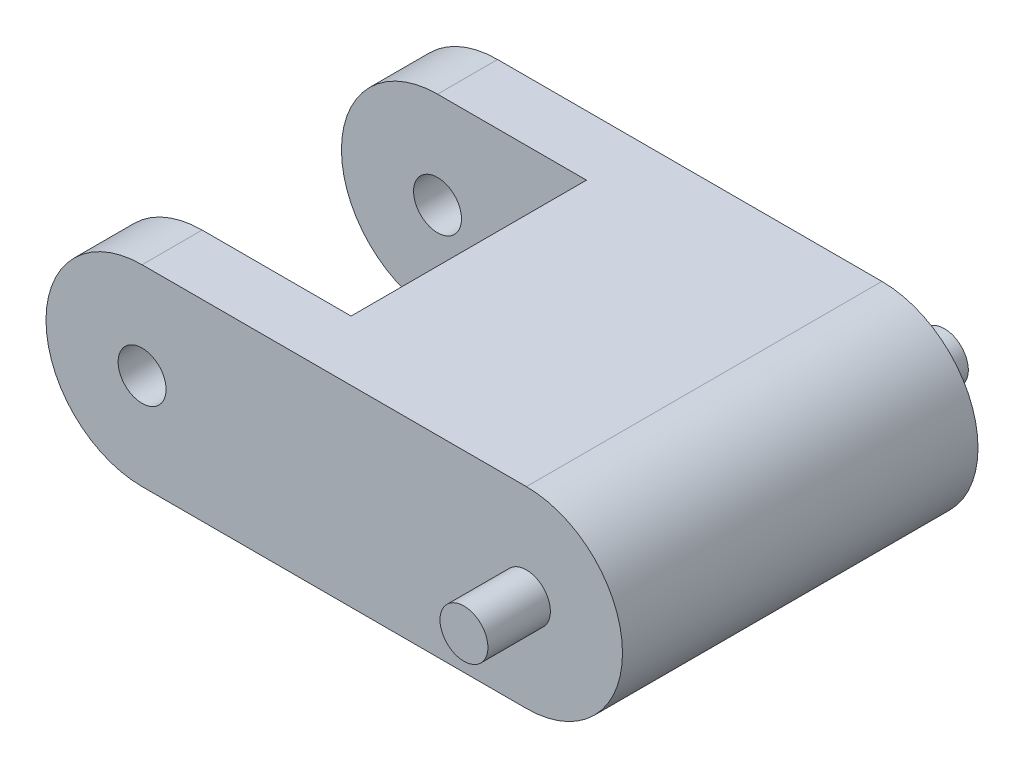
ISO-10303-21;
HEADER;
FILE_DESCRIPTION(('STEP AP214'),'2;1');
FILE_NAME('part.step','',(''),(''),'','','');
FILE_SCHEMA(('AUTOMOTIVE_DESIGN { 1 0 10303 214 1 1 1 1 }'));
ENDSEC;
DATA;
#1=APPLICATION_CONTEXT('core data for automotive mechanical design processes');
#2=APPLICATION_PROTOCOL_DEFINITION('international standard','automotive_design',2000,#1);
#3=PRODUCT_CONTEXT('',#1,'mechanical');
#4=PRODUCT('Part','Part','',(#3));
#5=PRODUCT_RELATED_PRODUCT_CATEGORY('part','',(#4));
#6=PRODUCT_DEFINITION_FORMATION('','',#4);
#7=PRODUCT_DEFINITION_CONTEXT('part definition',#1,'design');
#8=PRODUCT_DEFINITION('design','',#6,#7);
#9=PRODUCT_DEFINITION_SHAPE('','',#8);
#10=(LENGTH_UNIT() NAMED_UNIT(*) SI_UNIT(.MILLI.,.METRE.));
#11=(NAMED_UNIT(*) PLANE_ANGLE_UNIT() SI_UNIT($,.RADIAN.));
#12=(NAMED_UNIT(*) SI_UNIT($,.STERADIAN.) SOLID_ANGLE_UNIT());
#13=UNCERTAINTY_MEASURE_WITH_UNIT(LENGTH_MEASURE(1.E-05),#10,'distance_accuracy_value','');
#14=(GEOMETRIC_REPRESENTATION_CONTEXT(3) GLOBAL_UNCERTAINTY_ASSIGNED_CONTEXT((#13)) GLOBAL_UNIT_ASSIGNED_CONTEXT((#10,
#11,#12)) REPRESENTATION_CONTEXT('',''));
#15=CARTESIAN_POINT('',(0.,0.,0.));
#16=DIRECTION('',(0.,0.,1.));
#17=DIRECTION('',(1.,0.,0.));
#18=AXIS2_PLACEMENT_3D('',#15,#16,#17);
#19=CARTESIAN_POINT('',(0.,0.,148.));
#20=DIRECTION('',(0.,0.,-1.));
#21=DIRECTION('',(-1.,0.,0.));
#22=AXIS2_PLACEMENT_3D('',#19,#20,#21);
#23=CYLINDRICAL_SURFACE('',#22,40.);
#24=DIRECTION('',(0.,0.,-1.));
#25=VECTOR('',#24,1.);
#26=CARTESIAN_POINT('',(0.,40.,148.));
#27=LINE('',#26,#25);
#28=CARTESIAN_POINT('',(0.,40.,148.));
#29=VERTEX_POINT('',#28);
#30=CARTESIAN_POINT('',(0.,40.,123.));
#31=VERTEX_POINT('',#30);
#32=EDGE_CURVE('E170',#29,#31,#27,.T.);
#33=ORIENTED_EDGE('',*,*,#32,.T.);
#34=CARTESIAN_POINT('',(0.,0.,123.));
#35=DIRECTION('',(0.,0.,1.));
#36=DIRECTION('',(1.,0.,0.));
#37=AXIS2_PLACEMENT_3D('',#34,#35,#36);
#38=CIRCLE('',#37,40.);
#39=CARTESIAN_POINT('',(0.,-40.,123.));
#40=VERTEX_POINT('',#39);
#41=EDGE_CURVE('E123',#31,#40,#38,.T.);
#42=ORIENTED_EDGE('',*,*,#41,.T.);
#43=DIRECTION('',(0.,0.,-1.));
#44=VECTOR('',#43,1.);
#45=CARTESIAN_POINT('',(0.,-40.,148.));
#46=LINE('',#45,#44);
#47=CARTESIAN_POINT('',(0.,-40.,148.));
#48=VERTEX_POINT('',#47);
#49=EDGE_CURVE('E41',#48,#40,#46,.T.);
#50=ORIENTED_EDGE('',*,*,#49,.F.);
#51=CARTESIAN_POINT('',(0.,0.,148.));
#52=DIRECTION('',(0.,0.,1.));
#53=DIRECTION('',(1.,0.,0.));
#54=AXIS2_PLACEMENT_3D('',#51,#52,#53);
#55=CIRCLE('',#54,40.);
#56=EDGE_CURVE('E157',#29,#48,#55,.T.);
#57=ORIENTED_EDGE('',*,*,#56,.F.);
#58=EDGE_LOOP('',(#33,#42,#50,#57));
#59=FACE_BOUND('',#58,.T.);
#60=ADVANCED_FACE('F32',(#59),#23,.T.);
#61=CARTESIAN_POINT('',(0.,0.,148.));
#62=DIRECTION('',(0.,0.,-1.));
#63=DIRECTION('',(-1.,0.,0.));
#64=AXIS2_PLACEMENT_3D('',#61,#62,#63);
#65=CYLINDRICAL_SURFACE('',#64,9.977);
#66=CARTESIAN_POINT('',(0.,0.,123.));
#67=DIRECTION('',(0.,0.,1.));
#68=DIRECTION('',(1.,0.,0.));
#69=AXIS2_PLACEMENT_3D('',#66,#67,#68);
#70=CIRCLE('',#69,9.977);
#71=CARTESIAN_POINT('',(9.977,0.,123.));
#72=VERTEX_POINT('',#71);
#73=EDGE_CURVE('E36',#72,#72,#70,.T.);
#74=ORIENTED_EDGE('',*,*,#73,.F.);
#75=EDGE_LOOP('',(#74));
#76=FACE_BOUND('',#75,.T.);
#77=CARTESIAN_POINT('',(0.,0.,148.));
#78=DIRECTION('',(0.,0.,1.));
#79=DIRECTION('',(1.,0.,0.));
#80=AXIS2_PLACEMENT_3D('',#77,#78,#79);
#81=CIRCLE('',#80,9.977);
#82=CARTESIAN_POINT('',(9.977,0.,148.));
#83=VERTEX_POINT('',#82);
#84=EDGE_CURVE('E150',#83,#83,#81,.T.);
#85=ORIENTED_EDGE('',*,*,#84,.T.);
#86=EDGE_LOOP('',(#85));
#87=FACE_BOUND('',#86,.T.);
#88=ADVANCED_FACE('F192',(#76,#87),#65,.F.);
#89=CARTESIAN_POINT('',(0.,0.,148.));
#90=DIRECTION('',(0.,0.,1.));
#91=DIRECTION('',(1.,0.,0.));
#92=AXIS2_PLACEMENT_3D('',#89,#90,#91);
#93=PLANE('',#92);
#94=CARTESIAN_POINT('',(160.,0.,148.));
#95=DIRECTION('',(0.,0.,1.));
#96=DIRECTION('',(1.,0.,0.));
#97=AXIS2_PLACEMENT_3D('',#94,#95,#96);
#98=CIRCLE('',#97,9.97699999999998);
#99=CARTESIAN_POINT('',(169.977,0.,148.));
#100=VERTEX_POINT('',#99);
#101=EDGE_CURVE('E11',#100,#100,#98,.T.);
#102=ORIENTED_EDGE('',*,*,#101,.F.);
#103=EDGE_LOOP('',(#102));
#104=FACE_BOUND('',#103,.T.);
#105=ORIENTED_EDGE('',*,*,#56,.T.);
#106=DIRECTION('',(1.,0.,0.));
#107=VECTOR('',#106,1.);
#108=CARTESIAN_POINT('',(0.,-40.,148.));
#109=LINE('',#108,#107);
#110=CARTESIAN_POINT('',(160.,-40.,148.));
#111=VERTEX_POINT('',#110);
#112=EDGE_CURVE('E88',#48,#111,#109,.T.);
#113=ORIENTED_EDGE('',*,*,#112,.T.);
#114=CARTESIAN_POINT('',(160.,0.,148.));
#115=DIRECTION('',(0.,0.,1.));
#116=DIRECTION('',(1.,0.,0.));
#117=AXIS2_PLACEMENT_3D('',#114,#115,#116);
#118=CIRCLE('',#117,40.);
#119=CARTESIAN_POINT('',(160.,40.,148.));
#120=VERTEX_POINT('',#119);
#121=EDGE_CURVE('E161',#111,#120,#118,.T.);
#122=ORIENTED_EDGE('',*,*,#121,.T.);
#123=DIRECTION('',(-1.,0.,0.));
#124=VECTOR('',#123,1.);
#125=CARTESIAN_POINT('',(0.,40.,148.));
#126=LINE('',#125,#124);
#127=EDGE_CURVE('E58',#120,#29,#126,.T.);
#128=ORIENTED_EDGE('',*,*,#127,.T.);
#129=EDGE_LOOP('',(#105,#113,#122,#128));
#130=FACE_BOUND('',#129,.T.);
#131=ORIENTED_EDGE('',*,*,#84,.F.);
#132=EDGE_LOOP('',(#131));
#133=FACE_BOUND('',#132,.T.);
#134=ADVANCED_FACE('F197',(#104,#130,#133),#93,.T.);
#135=CARTESIAN_POINT('',(0.,0.,0.));
#136=DIRECTION('',(0.,0.,1.));
#137=DIRECTION('',(1.,0.,0.));
#138=AXIS2_PLACEMENT_3D('',#135,#136,#137);
#139=PLANE('',#138);
#140=CARTESIAN_POINT('',(160.,0.,0.));
#141=DIRECTION('',(0.,0.,1.));
#142=DIRECTION('',(1.,0.,0.));
#143=AXIS2_PLACEMENT_3D('',#140,#141,#142);
#144=CIRCLE('',#143,9.97699999999998);
#145=CARTESIAN_POINT('',(169.977,0.,0.));
#146=VERTEX_POINT('',#145);
#147=EDGE_CURVE('E148',#146,#146,#144,.T.);
#148=ORIENTED_EDGE('',*,*,#147,.T.);
#149=EDGE_LOOP('',(#148));
#150=FACE_BOUND('',#149,.T.);
#151=CARTESIAN_POINT('',(0.,0.,0.));
#152=DIRECTION('',(0.,0.,1.));
#153=DIRECTION('',(1.,0.,0.));
#154=AXIS2_PLACEMENT_3D('',#151,#152,#153);
#155=CIRCLE('',#154,40.);
#156=CARTESIAN_POINT('',(0.,40.,0.));
#157=VERTEX_POINT('',#156);
#158=CARTESIAN_POINT('',(0.,-40.,0.));
#159=VERTEX_POINT('',#158);
#160=EDGE_CURVE('E153',#157,#159,#155,.T.);
#161=ORIENTED_EDGE('',*,*,#160,.F.);
#162=DIRECTION('',(-1.,0.,0.));
#163=VECTOR('',#162,1.);
#164=CARTESIAN_POINT('',(0.,40.,0.));
#165=LINE('',#164,#163);
#166=CARTESIAN_POINT('',(160.,40.,0.));
#167=VERTEX_POINT('',#166);
#168=EDGE_CURVE('E159',#167,#157,#165,.T.);
#169=ORIENTED_EDGE('',*,*,#168,.F.);
#170=CARTESIAN_POINT('',(160.,0.,0.));
#171=DIRECTION('',(0.,0.,1.));
#172=DIRECTION('',(1.,0.,0.));
#173=AXIS2_PLACEMENT_3D('',#170,#171,#172);
#174=CIRCLE('',#173,40.);
#175=CARTESIAN_POINT('',(160.,-40.,0.));
#176=VERTEX_POINT('',#175);
#177=EDGE_CURVE('E167',#176,#167,#174,.T.);
#178=ORIENTED_EDGE('',*,*,#177,.F.);
#179=DIRECTION('',(1.,0.,0.));
#180=VECTOR('',#179,1.);
#181=CARTESIAN_POINT('',(0.,-40.,0.));
#182=LINE('',#181,#180);
#183=EDGE_CURVE('E165',#159,#176,#182,.T.);
#184=ORIENTED_EDGE('',*,*,#183,.F.);
#185=EDGE_LOOP('',(#161,#169,#178,#184));
#186=FACE_BOUND('',#185,.T.);
#187=CARTESIAN_POINT('',(0.,0.,0.));
#188=DIRECTION('',(0.,0.,1.));
#189=DIRECTION('',(1.,0.,0.));
#190=AXIS2_PLACEMENT_3D('',#187,#188,#189);
#191=CIRCLE('',#190,9.977);
#192=CARTESIAN_POINT('',(9.977,0.,0.));
#193=VERTEX_POINT('',#192);
#194=EDGE_CURVE('E154',#193,#193,#191,.T.);
#195=ORIENTED_EDGE('',*,*,#194,.T.);
#196=EDGE_LOOP('',(#195));
#197=FACE_BOUND('',#196,.T.);
#198=ADVANCED_FACE('F195',(#150,#186,#197),#139,.F.);
#199=CARTESIAN_POINT('',(0.,-40.,25.));
#200=VERTEX_POINT('',#199);
#201=EDGE_CURVE('E178',#200,#159,#46,.T.);
#202=ORIENTED_EDGE('',*,*,#201,.F.);
#203=CARTESIAN_POINT('',(0.,0.,25.));
#204=DIRECTION('',(0.,0.,-1.));
#205=DIRECTION('',(-1.,0.,0.));
#206=AXIS2_PLACEMENT_3D('',#203,#204,#205);
#207=CIRCLE('',#206,40.);
#208=CARTESIAN_POINT('',(0.,40.,25.));
#209=VERTEX_POINT('',#208);
#210=EDGE_CURVE('E137',#200,#209,#207,.T.);
#211=ORIENTED_EDGE('',*,*,#210,.T.);
#212=EDGE_CURVE('E80',#209,#157,#27,.T.);
#213=ORIENTED_EDGE('',*,*,#212,.T.);
#214=ORIENTED_EDGE('',*,*,#160,.T.);
#215=EDGE_LOOP('',(#202,#211,#213,#214));
#216=FACE_BOUND('',#215,.T.);
#217=ADVANCED_FACE('F34',(#216),#23,.T.);
#218=CARTESIAN_POINT('',(0.,-40.,148.));
#219=DIRECTION('',(0.,1.,0.));
#220=DIRECTION('',(-1.,0.,0.));
#221=AXIS2_PLACEMENT_3D('',#218,#219,#220);
#222=PLANE('',#221);
#223=ORIENTED_EDGE('',*,*,#49,.T.);
#224=DIRECTION('',(1.,0.,0.));
#225=VECTOR('',#224,1.);
#226=CARTESIAN_POINT('',(0.,-40.,123.));
#227=LINE('',#226,#225);
#228=CARTESIAN_POINT('',(62.0052820620174,-40.,123.));
#229=VERTEX_POINT('',#228);
#230=EDGE_CURVE('E139',#40,#229,#227,.T.);
#231=ORIENTED_EDGE('',*,*,#230,.T.);
#232=DIRECTION('',(0.,0.,-1.));
#233=VECTOR('',#232,1.);
#234=CARTESIAN_POINT('',(62.0052820620174,-40.,148.));
#235=LINE('',#234,#233);
#236=CARTESIAN_POINT('',(62.0052820620174,-40.,25.));
#237=VERTEX_POINT('',#236);
#238=EDGE_CURVE('E113',#229,#237,#235,.T.);
#239=ORIENTED_EDGE('',*,*,#238,.T.);
#240=DIRECTION('',(-1.,0.,0.));
#241=VECTOR('',#240,1.);
#242=CARTESIAN_POINT('',(0.,-40.,25.));
#243=LINE('',#242,#241);
#244=EDGE_CURVE('E134',#237,#200,#243,.T.);
#245=ORIENTED_EDGE('',*,*,#244,.T.);
#246=ORIENTED_EDGE('',*,*,#201,.T.);
#247=ORIENTED_EDGE('',*,*,#183,.T.);
#248=DIRECTION('',(0.,0.,-1.));
#249=VECTOR('',#248,1.);
#250=CARTESIAN_POINT('',(160.,-40.,148.));
#251=LINE('',#250,#249);
#252=EDGE_CURVE('E175',#111,#176,#251,.T.);
#253=ORIENTED_EDGE('',*,*,#252,.F.);
#254=ORIENTED_EDGE('',*,*,#112,.F.);
#255=EDGE_LOOP('',(#223,#231,#239,#245,#246,#247,#253,#254));
#256=FACE_BOUND('',#255,.T.);
#257=ADVANCED_FACE('F204',(#256),#222,.F.);
#258=CARTESIAN_POINT('',(160.,0.,148.));
#259=DIRECTION('',(0.,0.,-1.));
#260=DIRECTION('',(-1.,0.,0.));
#261=AXIS2_PLACEMENT_3D('',#258,#259,#260);
#262=CYLINDRICAL_SURFACE('',#261,40.);
#263=ORIENTED_EDGE('',*,*,#177,.T.);
#264=DIRECTION('',(0.,0.,-1.));
#265=VECTOR('',#264,1.);
#266=CARTESIAN_POINT('',(160.,40.,148.));
#267=LINE('',#266,#265);
#268=EDGE_CURVE('E172',#120,#167,#267,.T.);
#269=ORIENTED_EDGE('',*,*,#268,.F.);
#270=ORIENTED_EDGE('',*,*,#121,.F.);
#271=ORIENTED_EDGE('',*,*,#252,.T.);
#272=EDGE_LOOP('',(#263,#269,#270,#271));
#273=FACE_BOUND('',#272,.T.);
#274=ADVANCED_FACE('F256',(#273),#262,.T.);
#275=CARTESIAN_POINT('',(0.,40.,148.));
#276=DIRECTION('',(0.,-1.,0.));
#277=DIRECTION('',(0.,0.,-1.));
#278=AXIS2_PLACEMENT_3D('',#275,#276,#277);
#279=PLANE('',#278);
#280=DIRECTION('',(0.,0.,-1.));
#281=VECTOR('',#280,1.);
#282=CARTESIAN_POINT('',(62.0052820620174,40.,25.));
#283=LINE('',#282,#281);
#284=CARTESIAN_POINT('',(62.0052820620174,40.,123.));
#285=VERTEX_POINT('',#284);
#286=CARTESIAN_POINT('',(62.0052820620174,40.,25.));
#287=VERTEX_POINT('',#286);
#288=EDGE_CURVE('E49',#285,#287,#283,.T.);
#289=ORIENTED_EDGE('',*,*,#288,.F.);
#290=DIRECTION('',(1.,0.,0.));
#291=VECTOR('',#290,1.);
#292=CARTESIAN_POINT('',(62.0052820620174,40.,123.));
#293=LINE('',#292,#291);
#294=EDGE_CURVE('E120',#31,#285,#293,.T.);
#295=ORIENTED_EDGE('',*,*,#294,.F.);
#296=ORIENTED_EDGE('',*,*,#32,.F.);
#297=ORIENTED_EDGE('',*,*,#127,.F.);
#298=ORIENTED_EDGE('',*,*,#268,.T.);
#299=ORIENTED_EDGE('',*,*,#168,.T.);
#300=ORIENTED_EDGE('',*,*,#212,.F.);
#301=DIRECTION('',(-1.,0.,0.));
#302=VECTOR('',#301,1.);
#303=CARTESIAN_POINT('',(62.0052820620174,40.,25.));
#304=LINE('',#303,#302);
#305=EDGE_CURVE('E126',#287,#209,#304,.T.);
#306=ORIENTED_EDGE('',*,*,#305,.F.);
#307=EDGE_LOOP('',(#289,#295,#296,#297,#298,#299,#300,#306));
#308=FACE_BOUND('',#307,.T.);
#309=ADVANCED_FACE('F129',(#308),#279,.F.);
#310=CARTESIAN_POINT('',(0.,0.,25.));
#311=DIRECTION('',(0.,0.,-1.));
#312=DIRECTION('',(-1.,0.,0.));
#313=AXIS2_PLACEMENT_3D('',#310,#311,#312);
#314=CIRCLE('',#313,9.977);
#315=CARTESIAN_POINT('',(-9.977,0.,25.));
#316=VERTEX_POINT('',#315);
#317=EDGE_CURVE('E116',#316,#316,#314,.T.);
#318=ORIENTED_EDGE('',*,*,#317,.F.);
#319=EDGE_LOOP('',(#318));
#320=FACE_BOUND('',#319,.T.);
#321=ORIENTED_EDGE('',*,*,#194,.F.);
#322=EDGE_LOOP('',(#321));
#323=FACE_BOUND('',#322,.T.);
#324=ADVANCED_FACE('F187',(#320,#323),#65,.F.);
#325=CARTESIAN_POINT('',(160.,0.,-26.));
#326=DIRECTION('',(0.,0.,-1.));
#327=DIRECTION('',(-1.,0.,0.));
#328=AXIS2_PLACEMENT_3D('',#325,#326,#327);
#329=PLANE('',#328);
#330=CARTESIAN_POINT('',(160.,0.,-26.));
#331=DIRECTION('',(0.,0.,-1.));
#332=DIRECTION('',(-1.,0.,0.));
#333=AXIS2_PLACEMENT_3D('',#330,#331,#332);
#334=CIRCLE('',#333,9.97699999999998);
#335=CARTESIAN_POINT('',(150.023,0.,-26.));
#336=VERTEX_POINT('',#335);
#337=EDGE_CURVE('E143',#336,#336,#334,.T.);
#338=ORIENTED_EDGE('',*,*,#337,.T.);
#339=EDGE_LOOP('',(#338));
#340=FACE_BOUND('',#339,.T.);
#341=ADVANCED_FACE('F190',(#340),#329,.T.);
#342=CARTESIAN_POINT('',(160.,0.,174.));
#343=DIRECTION('',(0.,0.,-1.));
#344=DIRECTION('',(-1.,0.,0.));
#345=AXIS2_PLACEMENT_3D('',#342,#343,#344);
#346=CYLINDRICAL_SURFACE('',#345,9.97699999999998);
#347=ORIENTED_EDGE('',*,*,#337,.F.);
#348=EDGE_LOOP('',(#347));
#349=FACE_BOUND('',#348,.T.);
#350=ORIENTED_EDGE('',*,*,#147,.F.);
#351=EDGE_LOOP('',(#350));
#352=FACE_BOUND('',#351,.T.);
#353=ADVANCED_FACE('F238',(#349,#352),#346,.T.);
#354=ORIENTED_EDGE('',*,*,#101,.T.);
#355=EDGE_LOOP('',(#354));
#356=FACE_BOUND('',#355,.T.);
#357=CARTESIAN_POINT('',(160.,0.,174.));
#358=DIRECTION('',(0.,0.,-1.));
#359=DIRECTION('',(-1.,0.,0.));
#360=AXIS2_PLACEMENT_3D('',#357,#358,#359);
#361=CIRCLE('',#360,9.97699999999998);
#362=CARTESIAN_POINT('',(150.023,0.,174.));
#363=VERTEX_POINT('',#362);
#364=EDGE_CURVE('E146',#363,#363,#361,.T.);
#365=ORIENTED_EDGE('',*,*,#364,.T.);
#366=EDGE_LOOP('',(#365));
#367=FACE_BOUND('',#366,.T.);
#368=ADVANCED_FACE('F242',(#356,#367),#346,.T.);
#369=CARTESIAN_POINT('',(160.,0.,174.));
#370=DIRECTION('',(0.,0.,-1.));
#371=DIRECTION('',(-1.,0.,0.));
#372=AXIS2_PLACEMENT_3D('',#369,#370,#371);
#373=PLANE('',#372);
#374=ORIENTED_EDGE('',*,*,#364,.F.);
#375=EDGE_LOOP('',(#374));
#376=FACE_BOUND('',#375,.T.);
#377=ADVANCED_FACE('F235',(#376),#373,.F.);
#378=CARTESIAN_POINT('',(62.0052820620174,-91.0000000000001,25.));
#379=DIRECTION('',(1.,0.,0.));
#380=DIRECTION('',(0.,0.,-1.));
#381=AXIS2_PLACEMENT_3D('',#378,#379,#380);
#382=PLANE('',#381);
#383=DIRECTION('',(0.,1.,0.));
#384=VECTOR('',#383,1.);
#385=CARTESIAN_POINT('',(62.0052820620174,-91.0000000000001,123.));
#386=LINE('',#385,#384);
#387=EDGE_CURVE('E109',#229,#285,#386,.T.);
#388=ORIENTED_EDGE('',*,*,#387,.T.);
#389=ORIENTED_EDGE('',*,*,#288,.T.);
#390=DIRECTION('',(0.,1.,0.));
#391=VECTOR('',#390,1.);
#392=CARTESIAN_POINT('',(62.0052820620174,-91.0000000000001,25.));
#393=LINE('',#392,#391);
#394=EDGE_CURVE('E117',#237,#287,#393,.T.);
#395=ORIENTED_EDGE('',*,*,#394,.F.);
#396=ORIENTED_EDGE('',*,*,#238,.F.);
#397=EDGE_LOOP('',(#388,#389,#395,#396));
#398=FACE_BOUND('',#397,.T.);
#399=ADVANCED_FACE('F111',(#398),#382,.F.);
#400=CARTESIAN_POINT('',(62.0052820620174,-91.0000000000001,123.));
#401=DIRECTION('',(0.,0.,1.));
#402=DIRECTION('',(1.,0.,0.));
#403=AXIS2_PLACEMENT_3D('',#400,#401,#402);
#404=PLANE('',#403);
#405=ORIENTED_EDGE('',*,*,#73,.T.);
#406=EDGE_LOOP('',(#405));
#407=FACE_BOUND('',#406,.T.);
#408=ORIENTED_EDGE('',*,*,#294,.T.);
#409=ORIENTED_EDGE('',*,*,#387,.F.);
#410=ORIENTED_EDGE('',*,*,#230,.F.);
#411=ORIENTED_EDGE('',*,*,#41,.F.);
#412=EDGE_LOOP('',(#408,#409,#410,#411));
#413=FACE_BOUND('',#412,.T.);
#414=ADVANCED_FACE('F121',(#407,#413),#404,.F.);
#415=CARTESIAN_POINT('',(62.0052820620174,-91.0000000000001,25.));
#416=DIRECTION('',(0.,0.,-1.));
#417=DIRECTION('',(-1.,0.,0.));
#418=AXIS2_PLACEMENT_3D('',#415,#416,#417);
#419=PLANE('',#418);
#420=ORIENTED_EDGE('',*,*,#317,.T.);
#421=EDGE_LOOP('',(#420));
#422=FACE_BOUND('',#421,.T.);
#423=ORIENTED_EDGE('',*,*,#244,.F.);
#424=ORIENTED_EDGE('',*,*,#394,.T.);
#425=ORIENTED_EDGE('',*,*,#305,.T.);
#426=ORIENTED_EDGE('',*,*,#210,.F.);
#427=EDGE_LOOP('',(#423,#424,#425,#426));
#428=FACE_BOUND('',#427,.T.);
#429=ADVANCED_FACE('F184',(#422,#428),#419,.F.);
#430=CLOSED_SHELL('',(#60,#88,#134,#198,#217,#257,#274,#309,#324,#341,#353,#368,#377,#399,#414,#429));
#431=MANIFOLD_SOLID_BREP('B2',#430);
#432=ADVANCED_BREP_SHAPE_REPRESENTATION('',(#18,#431),#14);
#433=SHAPE_DEFINITION_REPRESENTATION(#9,#432);
ENDSEC;
END-ISO-10303-21;
